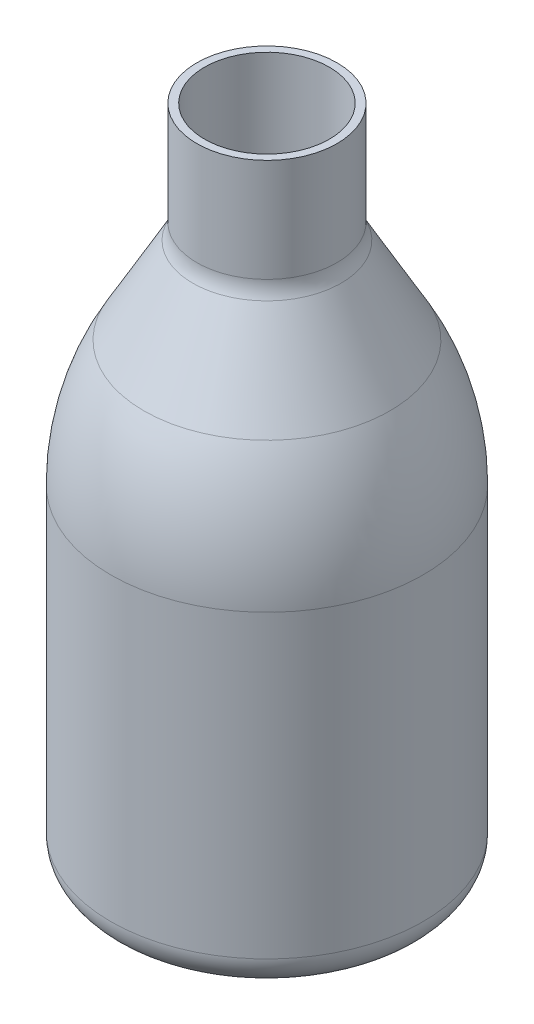
ISO-10303-21;
HEADER;
FILE_DESCRIPTION(('STEP AP214'),'2;1');
FILE_NAME('part.step','',(''),(''),'','','');
FILE_SCHEMA(('AUTOMOTIVE_DESIGN { 1 0 10303 214 1 1 1 1 }'));
ENDSEC;
DATA;
#1=APPLICATION_CONTEXT('core data for automotive mechanical design processes');
#2=APPLICATION_PROTOCOL_DEFINITION('international standard','automotive_design',2000,#1);
#3=PRODUCT_CONTEXT('',#1,'mechanical');
#4=PRODUCT('Part','Part','',(#3));
#5=PRODUCT_RELATED_PRODUCT_CATEGORY('part','',(#4));
#6=PRODUCT_DEFINITION_FORMATION('','',#4);
#7=PRODUCT_DEFINITION_CONTEXT('part definition',#1,'design');
#8=PRODUCT_DEFINITION('design','',#6,#7);
#9=PRODUCT_DEFINITION_SHAPE('','',#8);
#10=(LENGTH_UNIT() NAMED_UNIT(*) SI_UNIT(.MILLI.,.METRE.));
#11=(NAMED_UNIT(*) PLANE_ANGLE_UNIT() SI_UNIT($,.RADIAN.));
#12=(NAMED_UNIT(*) SI_UNIT($,.STERADIAN.) SOLID_ANGLE_UNIT());
#13=UNCERTAINTY_MEASURE_WITH_UNIT(LENGTH_MEASURE(1.E-05),#10,'distance_accuracy_value','');
#14=(GEOMETRIC_REPRESENTATION_CONTEXT(3) GLOBAL_UNCERTAINTY_ASSIGNED_CONTEXT((#13)) GLOBAL_UNIT_ASSIGNED_CONTEXT((#10,
#11,#12)) REPRESENTATION_CONTEXT('',''));
#15=CARTESIAN_POINT('',(0.,0.,0.));
#16=DIRECTION('',(0.,0.,1.));
#17=DIRECTION('',(1.,0.,0.));
#18=AXIS2_PLACEMENT_3D('',#15,#16,#17);
#19=CARTESIAN_POINT('',(0.,0.,0.));
#20=DIRECTION('',(0.,1.,0.));
#21=DIRECTION('',(0.,0.,1.));
#22=AXIS2_PLACEMENT_3D('',#19,#20,#21);
#23=PLANE('',#22);
#24=CARTESIAN_POINT('',(0.,0.,0.));
#25=DIRECTION('',(0.,1.,0.));
#26=DIRECTION('',(0.,0.,1.));
#27=AXIS2_PLACEMENT_3D('',#24,#25,#26);
#28=CIRCLE('',#27,24.765);
#29=CARTESIAN_POINT('',(0.,0.,24.765));
#30=VERTEX_POINT('',#29);
#31=EDGE_CURVE('E55',#30,#30,#28,.F.);
#32=ORIENTED_EDGE('',*,*,#31,.T.);
#33=EDGE_LOOP('',(#32));
#34=FACE_BOUND('',#33,.T.);
#35=ADVANCED_FACE('F37',(#34),#23,.F.);
#36=CARTESIAN_POINT('',(0.,0.,0.));
#37=DIRECTION('',(0.,-1.,0.));
#38=DIRECTION('',(0.,0.,-1.));
#39=AXIS2_PLACEMENT_3D('',#36,#37,#38);
#40=CYLINDRICAL_SURFACE('',#39,31.115);
#41=CARTESIAN_POINT('',(0.,66.1910707947805,0.));
#42=DIRECTION('',(0.,1.,0.));
#43=DIRECTION('',(0.,0.,1.));
#44=AXIS2_PLACEMENT_3D('',#41,#42,#43);
#45=CIRCLE('',#44,31.115);
#46=CARTESIAN_POINT('',(0.,66.1910707947805,31.115));
#47=VERTEX_POINT('',#46);
#48=EDGE_CURVE('E45',#47,#47,#45,.F.);
#49=ORIENTED_EDGE('',*,*,#48,.T.);
#50=EDGE_LOOP('',(#49));
#51=FACE_BOUND('',#50,.T.);
#52=CARTESIAN_POINT('',(0.,6.35,0.));
#53=DIRECTION('',(0.,1.,0.));
#54=DIRECTION('',(0.,0.,1.));
#55=AXIS2_PLACEMENT_3D('',#52,#53,#54);
#56=CIRCLE('',#55,31.115);
#57=CARTESIAN_POINT('',(0.,6.35,31.115));
#58=VERTEX_POINT('',#57);
#59=EDGE_CURVE('E50',#58,#58,#56,.T.);
#60=ORIENTED_EDGE('',*,*,#59,.T.);
#61=EDGE_LOOP('',(#60));
#62=FACE_BOUND('',#61,.T.);
#63=ADVANCED_FACE('F118',(#51,#62),#40,.T.);
#64=CARTESIAN_POINT('',(0.,109.855,0.));
#65=DIRECTION('',(0.,-1.,0.));
#66=DIRECTION('',(0.,0.,-1.));
#67=AXIS2_PLACEMENT_3D('',#64,#65,#66);
#68=CONICAL_SURFACE('',#67,13.97,0.515200366101709);
#69=CARTESIAN_POINT('',(0.,91.2206989832402,0.));
#70=DIRECTION('',(0.,1.,0.));
#71=DIRECTION('',(0.,0.,1.));
#72=AXIS2_PLACEMENT_3D('',#69,#70,#71);
#73=CIRCLE('',#72,24.5208560911048);
#74=CARTESIAN_POINT('',(0.,91.2206989832402,24.5208560911048));
#75=VERTEX_POINT('',#74);
#76=EDGE_CURVE('E10',#75,#75,#73,.T.);
#77=ORIENTED_EDGE('',*,*,#76,.T.);
#78=EDGE_LOOP('',(#77));
#79=FACE_BOUND('',#78,.T.);
#80=CARTESIAN_POINT('',(0.,108.399226393987,0.));
#81=DIRECTION('',(0.,-1.,0.));
#82=DIRECTION('',(0.,0.,-1.));
#83=AXIS2_PLACEMENT_3D('',#80,#81,#82);
#84=CIRCLE('',#83,14.7942679886119);
#85=CARTESIAN_POINT('',(0.,108.399226393987,-14.7942679886119));
#86=VERTEX_POINT('',#85);
#87=EDGE_CURVE('E65',#86,#86,#84,.T.);
#88=ORIENTED_EDGE('',*,*,#87,.T.);
#89=EDGE_LOOP('',(#88));
#90=FACE_BOUND('',#89,.T.);
#91=ADVANCED_FACE('F124',(#79,#90),#68,.T.);
#92=CARTESIAN_POINT('',(0.,0.,0.));
#93=DIRECTION('',(0.,-1.,0.));
#94=DIRECTION('',(0.,0.,-1.));
#95=AXIS2_PLACEMENT_3D('',#92,#93,#94);
#96=CYLINDRICAL_SURFACE('',#95,13.97);
#97=CARTESIAN_POINT('',(0.,111.527929917544,0.));
#98=DIRECTION('',(0.,-1.,0.));
#99=DIRECTION('',(0.,0.,-1.));
#100=AXIS2_PLACEMENT_3D('',#97,#98,#99);
#101=CIRCLE('',#100,13.97);
#102=CARTESIAN_POINT('',(0.,111.527929917544,-13.97));
#103=VERTEX_POINT('',#102);
#104=EDGE_CURVE('E61',#103,#103,#101,.F.);
#105=ORIENTED_EDGE('',*,*,#104,.T.);
#106=EDGE_LOOP('',(#105));
#107=FACE_BOUND('',#106,.T.);
#108=CARTESIAN_POINT('',(0.,132.08,0.));
#109=DIRECTION('',(0.,-1.,0.));
#110=DIRECTION('',(0.,0.,-1.));
#111=AXIS2_PLACEMENT_3D('',#108,#109,#110);
#112=CIRCLE('',#111,13.97);
#113=CARTESIAN_POINT('',(0.,132.08,-13.97));
#114=VERTEX_POINT('',#113);
#115=EDGE_CURVE('E69',#114,#114,#112,.T.);
#116=ORIENTED_EDGE('',*,*,#115,.T.);
#117=EDGE_LOOP('',(#116));
#118=FACE_BOUND('',#117,.T.);
#119=ADVANCED_FACE('F160',(#107,#118),#96,.T.);
#120=CARTESIAN_POINT('',(-13.97,132.08,0.));
#121=DIRECTION('',(0.,-1.,0.));
#122=DIRECTION('',(0.,0.,-1.));
#123=AXIS2_PLACEMENT_3D('',#120,#121,#122);
#124=PLANE('',#123);
#125=CARTESIAN_POINT('',(0.,132.08,0.));
#126=DIRECTION('',(0.,-1.,0.));
#127=DIRECTION('',(0.,0.,-1.));
#128=AXIS2_PLACEMENT_3D('',#125,#126,#127);
#129=CIRCLE('',#128,12.446);
#130=CARTESIAN_POINT('',(0.,132.08,-12.446));
#131=VERTEX_POINT('',#130);
#132=EDGE_CURVE('E74',#131,#131,#129,.T.);
#133=ORIENTED_EDGE('',*,*,#132,.T.);
#134=EDGE_LOOP('',(#133));
#135=FACE_BOUND('',#134,.T.);
#136=ORIENTED_EDGE('',*,*,#115,.F.);
#137=EDGE_LOOP('',(#136));
#138=FACE_BOUND('',#137,.T.);
#139=ADVANCED_FACE('F130',(#135,#138),#124,.F.);
#140=CARTESIAN_POINT('',(0.,111.527929917544,0.));
#141=DIRECTION('',(0.,-1.,0.));
#142=DIRECTION('',(0.,0.,-1.));
#143=AXIS2_PLACEMENT_3D('',#140,#141,#142);
#144=TOROIDAL_SURFACE('',#143,20.32,6.35);
#145=ORIENTED_EDGE('',*,*,#104,.F.);
#146=EDGE_LOOP('',(#145));
#147=FACE_BOUND('',#146,.T.);
#148=ORIENTED_EDGE('',*,*,#87,.F.);
#149=EDGE_LOOP('',(#148));
#150=FACE_BOUND('',#149,.T.);
#151=ADVANCED_FACE('F128',(#147,#150),#144,.F.);
#152=CARTESIAN_POINT('',(0.,6.35,0.));
#153=DIRECTION('',(0.,1.,0.));
#154=DIRECTION('',(0.,0.,1.));
#155=AXIS2_PLACEMENT_3D('',#152,#153,#154);
#156=TOROIDAL_SURFACE('',#155,24.765,6.35);
#157=ORIENTED_EDGE('',*,*,#59,.F.);
#158=EDGE_LOOP('',(#157));
#159=FACE_BOUND('',#158,.T.);
#160=ORIENTED_EDGE('',*,*,#31,.F.);
#161=EDGE_LOOP('',(#160));
#162=FACE_BOUND('',#161,.T.);
#163=ADVANCED_FACE('F115',(#159,#162),#156,.T.);
#164=CARTESIAN_POINT('',(0.,66.1910707947805,0.));
#165=DIRECTION('',(0.,1.,0.));
#166=DIRECTION('',(0.,0.,1.));
#167=AXIS2_PLACEMENT_3D('',#164,#165,#166);
#168=DEGENERATE_TOROIDAL_SURFACE('',#167,19.685,50.8,.F.);
#169=ORIENTED_EDGE('',*,*,#76,.F.);
#170=EDGE_LOOP('',(#169));
#171=FACE_BOUND('',#170,.T.);
#172=ORIENTED_EDGE('',*,*,#48,.F.);
#173=EDGE_LOOP('',(#172));
#174=FACE_BOUND('',#173,.T.);
#175=ADVANCED_FACE('F39',(#171,#174),#168,.F.);
#176=CARTESIAN_POINT('',(0.,1.524,0.));
#177=DIRECTION('',(0.,1.,0.));
#178=DIRECTION('',(0.,0.,1.));
#179=AXIS2_PLACEMENT_3D('',#176,#177,#178);
#180=PLANE('',#179);
#181=CARTESIAN_POINT('',(0.,1.524,0.));
#182=DIRECTION('',(0.,1.,0.));
#183=DIRECTION('',(0.,0.,1.));
#184=AXIS2_PLACEMENT_3D('',#181,#182,#183);
#185=CIRCLE('',#184,24.765);
#186=CARTESIAN_POINT('',(0.,1.524,24.765));
#187=VERTEX_POINT('',#186);
#188=EDGE_CURVE('E83',#187,#187,#185,.F.);
#189=ORIENTED_EDGE('',*,*,#188,.F.);
#190=EDGE_LOOP('',(#189));
#191=FACE_BOUND('',#190,.T.);
#192=ADVANCED_FACE('F104',(#191),#180,.T.);
#193=CARTESIAN_POINT('',(0.,0.,0.));
#194=DIRECTION('',(0.,-1.,0.));
#195=DIRECTION('',(0.,0.,-1.));
#196=AXIS2_PLACEMENT_3D('',#193,#194,#195);
#197=CYLINDRICAL_SURFACE('',#196,29.591);
#198=CARTESIAN_POINT('',(0.,66.1910707947805,0.));
#199=DIRECTION('',(0.,-1.,0.));
#200=DIRECTION('',(0.,0.,-1.));
#201=AXIS2_PLACEMENT_3D('',#198,#199,#200);
#202=CIRCLE('',#201,29.591);
#203=CARTESIAN_POINT('',(0.,66.1910707947805,-29.591));
#204=VERTEX_POINT('',#203);
#205=EDGE_CURVE('E90',#204,#204,#202,.T.);
#206=ORIENTED_EDGE('',*,*,#205,.F.);
#207=EDGE_LOOP('',(#206));
#208=FACE_BOUND('',#207,.T.);
#209=CARTESIAN_POINT('',(0.,6.35,0.));
#210=DIRECTION('',(0.,-1.,0.));
#211=DIRECTION('',(0.,0.,-1.));
#212=AXIS2_PLACEMENT_3D('',#209,#210,#211);
#213=CIRCLE('',#212,29.591);
#214=CARTESIAN_POINT('',(0.,6.35,-29.591));
#215=VERTEX_POINT('',#214);
#216=EDGE_CURVE('E94',#215,#215,#213,.F.);
#217=ORIENTED_EDGE('',*,*,#216,.F.);
#218=EDGE_LOOP('',(#217));
#219=FACE_BOUND('',#218,.T.);
#220=ADVANCED_FACE('F106',(#208,#219),#197,.F.);
#221=CARTESIAN_POINT('',(0.,109.104111154346,0.));
#222=DIRECTION('',(0.,-1.,0.));
#223=DIRECTION('',(0.,0.,-1.));
#224=AXIS2_PLACEMENT_3D('',#221,#222,#223);
#225=CONICAL_SURFACE('',#224,12.6438243172669,0.515200366101709);
#226=CARTESIAN_POINT('',(0.,90.4698101375864,0.));
#227=DIRECTION('',(0.,-1.,0.));
#228=DIRECTION('',(0.,0.,-1.));
#229=AXIS2_PLACEMENT_3D('',#226,#227,#228);
#230=CIRCLE('',#229,23.1946804083716);
#231=CARTESIAN_POINT('',(0.,90.4698101375864,-23.1946804083716));
#232=VERTEX_POINT('',#231);
#233=EDGE_CURVE('E73',#232,#232,#230,.F.);
#234=ORIENTED_EDGE('',*,*,#233,.F.);
#235=EDGE_LOOP('',(#234));
#236=FACE_BOUND('',#235,.T.);
#237=CARTESIAN_POINT('',(0.,107.648337548333,0.));
#238=DIRECTION('',(0.,-1.,0.));
#239=DIRECTION('',(0.,0.,-1.));
#240=AXIS2_PLACEMENT_3D('',#237,#238,#239);
#241=CIRCLE('',#240,13.4680923058788);
#242=CARTESIAN_POINT('',(0.,107.648337548333,-13.4680923058788));
#243=VERTEX_POINT('',#242);
#244=EDGE_CURVE('E78',#243,#243,#241,.T.);
#245=ORIENTED_EDGE('',*,*,#244,.F.);
#246=EDGE_LOOP('',(#245));
#247=FACE_BOUND('',#246,.T.);
#248=ADVANCED_FACE('F112',(#236,#247),#225,.F.);
#249=CARTESIAN_POINT('',(0.,0.,0.));
#250=DIRECTION('',(0.,-1.,0.));
#251=DIRECTION('',(0.,0.,-1.));
#252=AXIS2_PLACEMENT_3D('',#249,#250,#251);
#253=CYLINDRICAL_SURFACE('',#252,12.446);
#254=CARTESIAN_POINT('',(0.,111.527929917544,0.));
#255=DIRECTION('',(0.,-1.,0.));
#256=DIRECTION('',(0.,0.,-1.));
#257=AXIS2_PLACEMENT_3D('',#254,#255,#256);
#258=CIRCLE('',#257,12.446);
#259=CARTESIAN_POINT('',(0.,111.527929917544,-12.446));
#260=VERTEX_POINT('',#259);
#261=EDGE_CURVE('E79',#260,#260,#258,.F.);
#262=ORIENTED_EDGE('',*,*,#261,.F.);
#263=EDGE_LOOP('',(#262));
#264=FACE_BOUND('',#263,.T.);
#265=ORIENTED_EDGE('',*,*,#132,.F.);
#266=EDGE_LOOP('',(#265));
#267=FACE_BOUND('',#266,.T.);
#268=ADVANCED_FACE('F183',(#264,#267),#253,.F.);
#269=CARTESIAN_POINT('',(0.,111.527929917544,0.));
#270=DIRECTION('',(0.,-1.,0.));
#271=DIRECTION('',(0.,0.,-1.));
#272=AXIS2_PLACEMENT_3D('',#269,#270,#271);
#273=TOROIDAL_SURFACE('',#272,20.32,7.874);
#274=ORIENTED_EDGE('',*,*,#261,.T.);
#275=EDGE_LOOP('',(#274));
#276=FACE_BOUND('',#275,.T.);
#277=ORIENTED_EDGE('',*,*,#244,.T.);
#278=EDGE_LOOP('',(#277));
#279=FACE_BOUND('',#278,.T.);
#280=ADVANCED_FACE('F193',(#276,#279),#273,.T.);
#281=CARTESIAN_POINT('',(0.,6.35,0.));
#282=DIRECTION('',(0.,1.,0.));
#283=DIRECTION('',(0.,0.,1.));
#284=AXIS2_PLACEMENT_3D('',#281,#282,#283);
#285=TOROIDAL_SURFACE('',#284,24.765,4.826);
#286=ORIENTED_EDGE('',*,*,#216,.T.);
#287=EDGE_LOOP('',(#286));
#288=FACE_BOUND('',#287,.T.);
#289=ORIENTED_EDGE('',*,*,#188,.T.);
#290=EDGE_LOOP('',(#289));
#291=FACE_BOUND('',#290,.T.);
#292=ADVANCED_FACE('F102',(#288,#291),#285,.F.);
#293=CARTESIAN_POINT('',(0.,66.1910707947805,0.));
#294=DIRECTION('',(0.,1.,0.));
#295=DIRECTION('',(0.,0.,1.));
#296=AXIS2_PLACEMENT_3D('',#293,#294,#295);
#297=DEGENERATE_TOROIDAL_SURFACE('',#296,19.685,49.276,.F.);
#298=ORIENTED_EDGE('',*,*,#233,.T.);
#299=EDGE_LOOP('',(#298));
#300=FACE_BOUND('',#299,.T.);
#301=ORIENTED_EDGE('',*,*,#205,.T.);
#302=EDGE_LOOP('',(#301));
#303=FACE_BOUND('',#302,.T.);
#304=ADVANCED_FACE('F212',(#300,#303),#297,.T.);
#305=CLOSED_SHELL('',(#35,#63,#91,#119,#139,#151,#163,#175,#192,#220,#248,#268,#280,#292,#304));
#306=MANIFOLD_SOLID_BREP('B2',#305);
#307=ADVANCED_BREP_SHAPE_REPRESENTATION('',(#18,#306),#14);
#308=SHAPE_DEFINITION_REPRESENTATION(#9,#307);
ENDSEC;
END-ISO-10303-21;
